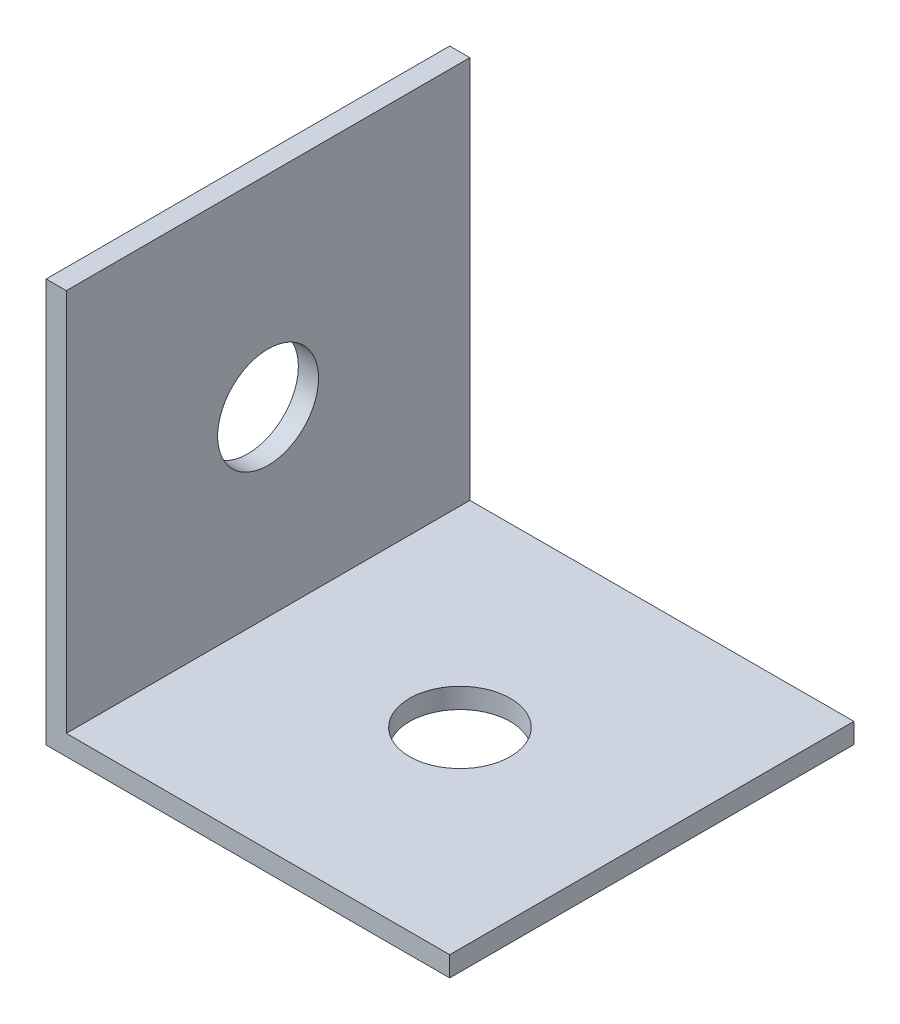
ISO-10303-21;
HEADER;
FILE_DESCRIPTION(('STEP AP214'),'2;1');
FILE_NAME('part.step','',(''),(''),'','','');
FILE_SCHEMA(('AUTOMOTIVE_DESIGN { 1 0 10303 214 1 1 1 1 }'));
ENDSEC;
DATA;
#1=APPLICATION_CONTEXT('core data for automotive mechanical design processes');
#2=APPLICATION_PROTOCOL_DEFINITION('international standard','automotive_design',2000,#1);
#3=PRODUCT_CONTEXT('',#1,'mechanical');
#4=PRODUCT('Part','Part','',(#3));
#5=PRODUCT_RELATED_PRODUCT_CATEGORY('part','',(#4));
#6=PRODUCT_DEFINITION_FORMATION('','',#4);
#7=PRODUCT_DEFINITION_CONTEXT('part definition',#1,'design');
#8=PRODUCT_DEFINITION('design','',#6,#7);
#9=PRODUCT_DEFINITION_SHAPE('','',#8);
#10=(LENGTH_UNIT() NAMED_UNIT(*) SI_UNIT(.MILLI.,.METRE.));
#11=(NAMED_UNIT(*) PLANE_ANGLE_UNIT() SI_UNIT($,.RADIAN.));
#12=(NAMED_UNIT(*) SI_UNIT($,.STERADIAN.) SOLID_ANGLE_UNIT());
#13=UNCERTAINTY_MEASURE_WITH_UNIT(LENGTH_MEASURE(1.E-05),#10,'distance_accuracy_value','');
#14=(GEOMETRIC_REPRESENTATION_CONTEXT(3) GLOBAL_UNCERTAINTY_ASSIGNED_CONTEXT((#13)) GLOBAL_UNIT_ASSIGNED_CONTEXT((#10,
#11,#12)) REPRESENTATION_CONTEXT('',''));
#15=CARTESIAN_POINT('',(0.,0.,0.));
#16=DIRECTION('',(0.,0.,1.));
#17=DIRECTION('',(1.,0.,0.));
#18=AXIS2_PLACEMENT_3D('',#15,#16,#17);
#19=CARTESIAN_POINT('',(1.27,0.,0.));
#20=DIRECTION('',(1.,0.,0.));
#21=DIRECTION('',(0.,0.,-1.));
#22=AXIS2_PLACEMENT_3D('',#19,#20,#21);
#23=PLANE('',#22);
#24=CARTESIAN_POINT('',(1.27,0.,0.));
#25=DIRECTION('',(1.,0.,0.));
#26=DIRECTION('',(0.,0.,-1.));
#27=AXIS2_PLACEMENT_3D('',#24,#25,#26);
#28=CIRCLE('',#27,3.175);
#29=CARTESIAN_POINT('',(1.27,0.,-3.175));
#30=VERTEX_POINT('',#29);
#31=EDGE_CURVE('E161',#30,#30,#28,.T.);
#32=ORIENTED_EDGE('',*,*,#31,.F.);
#33=EDGE_LOOP('',(#32));
#34=FACE_BOUND('',#33,.T.);
#35=DIRECTION('',(0.,-1.,0.));
#36=VECTOR('',#35,1.);
#37=CARTESIAN_POINT('',(1.27,12.7,12.7));
#38=LINE('',#37,#36);
#39=CARTESIAN_POINT('',(1.27,12.7,12.7));
#40=VERTEX_POINT('',#39);
#41=CARTESIAN_POINT('',(1.27,-11.43,12.7));
#42=VERTEX_POINT('',#41);
#43=EDGE_CURVE('E102',#40,#42,#38,.T.);
#44=ORIENTED_EDGE('',*,*,#43,.T.);
#45=DIRECTION('',(0.,0.,-1.));
#46=VECTOR('',#45,1.);
#47=CARTESIAN_POINT('',(1.27,-11.43,12.7));
#48=LINE('',#47,#46);
#49=CARTESIAN_POINT('',(1.27,-11.43,-12.7));
#50=VERTEX_POINT('',#49);
#51=EDGE_CURVE('E126',#42,#50,#48,.T.);
#52=ORIENTED_EDGE('',*,*,#51,.T.);
#53=DIRECTION('',(0.,1.,0.));
#54=VECTOR('',#53,1.);
#55=CARTESIAN_POINT('',(1.27,12.7,-12.7));
#56=LINE('',#55,#54);
#57=CARTESIAN_POINT('',(1.27,12.7,-12.7));
#58=VERTEX_POINT('',#57);
#59=EDGE_CURVE('E93',#50,#58,#56,.T.);
#60=ORIENTED_EDGE('',*,*,#59,.T.);
#61=DIRECTION('',(0.,0.,1.));
#62=VECTOR('',#61,1.);
#63=CARTESIAN_POINT('',(1.27,12.7,12.7));
#64=LINE('',#63,#62);
#65=EDGE_CURVE('E60',#58,#40,#64,.T.);
#66=ORIENTED_EDGE('',*,*,#65,.T.);
#67=EDGE_LOOP('',(#44,#52,#60,#66));
#68=FACE_BOUND('',#67,.T.);
#69=ADVANCED_FACE('F36',(#34,#68),#23,.T.);
#70=CARTESIAN_POINT('',(1.27,12.7,-12.7));
#71=DIRECTION('',(0.,0.,1.));
#72=DIRECTION('',(0.,-1.,0.));
#73=AXIS2_PLACEMENT_3D('',#70,#71,#72);
#74=PLANE('',#73);
#75=DIRECTION('',(0.,1.,0.));
#76=VECTOR('',#75,1.);
#77=CARTESIAN_POINT('',(0.,12.7,-12.7));
#78=LINE('',#77,#76);
#79=CARTESIAN_POINT('',(0.,-12.7,-12.7));
#80=VERTEX_POINT('',#79);
#81=CARTESIAN_POINT('',(0.,12.7,-12.7));
#82=VERTEX_POINT('',#81);
#83=EDGE_CURVE('E99',#80,#82,#78,.T.);
#84=ORIENTED_EDGE('',*,*,#83,.T.);
#85=DIRECTION('',(-1.,0.,0.));
#86=VECTOR('',#85,1.);
#87=CARTESIAN_POINT('',(1.27,12.7,-12.7));
#88=LINE('',#87,#86);
#89=EDGE_CURVE('E11',#58,#82,#88,.T.);
#90=ORIENTED_EDGE('',*,*,#89,.F.);
#91=ORIENTED_EDGE('',*,*,#59,.F.);
#92=CARTESIAN_POINT('',(1.27,-12.7,-12.7));
#93=VERTEX_POINT('',#92);
#94=EDGE_CURVE('E101',#93,#50,#56,.T.);
#95=ORIENTED_EDGE('',*,*,#94,.F.);
#96=DIRECTION('',(-1.,0.,0.));
#97=VECTOR('',#96,1.);
#98=CARTESIAN_POINT('',(1.27,-12.7,-12.7));
#99=LINE('',#98,#97);
#100=EDGE_CURVE('E85',#93,#80,#99,.T.);
#101=ORIENTED_EDGE('',*,*,#100,.T.);
#102=EDGE_LOOP('',(#84,#90,#91,#95,#101));
#103=FACE_BOUND('',#102,.T.);
#104=ADVANCED_FACE('F38',(#103),#74,.F.);
#105=CARTESIAN_POINT('',(1.27,12.7,12.7));
#106=DIRECTION('',(0.,-1.,0.));
#107=DIRECTION('',(0.,0.,-1.));
#108=AXIS2_PLACEMENT_3D('',#105,#106,#107);
#109=PLANE('',#108);
#110=DIRECTION('',(0.,0.,1.));
#111=VECTOR('',#110,1.);
#112=CARTESIAN_POINT('',(0.,12.7,12.7));
#113=LINE('',#112,#111);
#114=CARTESIAN_POINT('',(0.,12.7,12.7));
#115=VERTEX_POINT('',#114);
#116=EDGE_CURVE('E105',#82,#115,#113,.T.);
#117=ORIENTED_EDGE('',*,*,#116,.T.);
#118=DIRECTION('',(-1.,0.,0.));
#119=VECTOR('',#118,1.);
#120=CARTESIAN_POINT('',(1.27,12.7,12.7));
#121=LINE('',#120,#119);
#122=EDGE_CURVE('E44',#40,#115,#121,.T.);
#123=ORIENTED_EDGE('',*,*,#122,.F.);
#124=ORIENTED_EDGE('',*,*,#65,.F.);
#125=ORIENTED_EDGE('',*,*,#89,.T.);
#126=EDGE_LOOP('',(#117,#123,#124,#125));
#127=FACE_BOUND('',#126,.T.);
#128=ADVANCED_FACE('F122',(#127),#109,.F.);
#129=CARTESIAN_POINT('',(1.27,12.7,12.7));
#130=DIRECTION('',(0.,0.,-1.));
#131=DIRECTION('',(0.,1.,0.));
#132=AXIS2_PLACEMENT_3D('',#129,#130,#131);
#133=PLANE('',#132);
#134=DIRECTION('',(0.,-1.,0.));
#135=VECTOR('',#134,1.);
#136=CARTESIAN_POINT('',(0.,12.7,12.7));
#137=LINE('',#136,#135);
#138=CARTESIAN_POINT('',(0.,-12.7,12.7));
#139=VERTEX_POINT('',#138);
#140=EDGE_CURVE('E94',#115,#139,#137,.T.);
#141=ORIENTED_EDGE('',*,*,#140,.T.);
#142=DIRECTION('',(-1.,0.,0.));
#143=VECTOR('',#142,1.);
#144=CARTESIAN_POINT('',(1.27,-12.7,12.7));
#145=LINE('',#144,#143);
#146=CARTESIAN_POINT('',(25.4,-12.7,12.7));
#147=VERTEX_POINT('',#146);
#148=EDGE_CURVE('E89',#147,#139,#145,.T.);
#149=ORIENTED_EDGE('',*,*,#148,.F.);
#150=DIRECTION('',(0.,-1.,0.));
#151=VECTOR('',#150,1.);
#152=CARTESIAN_POINT('',(25.4,-11.43,12.7));
#153=LINE('',#152,#151);
#154=CARTESIAN_POINT('',(25.4,-11.43,12.7));
#155=VERTEX_POINT('',#154);
#156=EDGE_CURVE('E106',#155,#147,#153,.T.);
#157=ORIENTED_EDGE('',*,*,#156,.F.);
#158=DIRECTION('',(-1.,0.,0.));
#159=VECTOR('',#158,1.);
#160=CARTESIAN_POINT('',(1.27,-11.43,12.7));
#161=LINE('',#160,#159);
#162=EDGE_CURVE('E148',#155,#42,#161,.T.);
#163=ORIENTED_EDGE('',*,*,#162,.T.);
#164=ORIENTED_EDGE('',*,*,#43,.F.);
#165=ORIENTED_EDGE('',*,*,#122,.T.);
#166=EDGE_LOOP('',(#141,#149,#157,#163,#164,#165));
#167=FACE_BOUND('',#166,.T.);
#168=ADVANCED_FACE('F119',(#167),#133,.F.);
#169=CARTESIAN_POINT('',(1.27,-12.7,12.7));
#170=DIRECTION('',(0.,1.,0.));
#171=DIRECTION('',(0.,0.,1.));
#172=AXIS2_PLACEMENT_3D('',#169,#170,#171);
#173=PLANE('',#172);
#174=CARTESIAN_POINT('',(13.335,-12.7,-0.00966250279427205));
#175=DIRECTION('',(0.,1.,0.));
#176=DIRECTION('',(0.,0.,1.));
#177=AXIS2_PLACEMENT_3D('',#174,#175,#176);
#178=CIRCLE('',#177,3.175);
#179=CARTESIAN_POINT('',(13.335,-12.7,3.16533749720573));
#180=VERTEX_POINT('',#179);
#181=EDGE_CURVE('E166',#180,#180,#178,.T.);
#182=ORIENTED_EDGE('',*,*,#181,.T.);
#183=EDGE_LOOP('',(#182));
#184=FACE_BOUND('',#183,.T.);
#185=DIRECTION('',(0.,0.,-1.));
#186=VECTOR('',#185,1.);
#187=CARTESIAN_POINT('',(0.,-12.7,12.7));
#188=LINE('',#187,#186);
#189=EDGE_CURVE('E80',#139,#80,#188,.T.);
#190=ORIENTED_EDGE('',*,*,#189,.T.);
#191=ORIENTED_EDGE('',*,*,#100,.F.);
#192=DIRECTION('',(0.999998717215297,0.,-0.00160173898041636));
#193=VECTOR('',#192,1.);
#194=CARTESIAN_POINT('',(25.4,-12.7,-12.7386500111771));
#195=LINE('',#194,#193);
#196=CARTESIAN_POINT('',(25.4,-12.7,-12.7386500111771));
#197=VERTEX_POINT('',#196);
#198=EDGE_CURVE('E157',#93,#197,#195,.T.);
#199=ORIENTED_EDGE('',*,*,#198,.T.);
#200=DIRECTION('',(0.,0.,1.));
#201=VECTOR('',#200,1.);
#202=CARTESIAN_POINT('',(25.4,-12.7,12.7));
#203=LINE('',#202,#201);
#204=EDGE_CURVE('E146',#197,#147,#203,.T.);
#205=ORIENTED_EDGE('',*,*,#204,.T.);
#206=ORIENTED_EDGE('',*,*,#148,.T.);
#207=EDGE_LOOP('',(#190,#191,#199,#205,#206));
#208=FACE_BOUND('',#207,.T.);
#209=ADVANCED_FACE('F82',(#184,#208),#173,.F.);
#210=CARTESIAN_POINT('',(0.,0.,0.));
#211=DIRECTION('',(1.,0.,0.));
#212=DIRECTION('',(0.,0.,-1.));
#213=AXIS2_PLACEMENT_3D('',#210,#211,#212);
#214=PLANE('',#213);
#215=CARTESIAN_POINT('',(0.,0.,0.));
#216=DIRECTION('',(1.,0.,0.));
#217=DIRECTION('',(0.,0.,-1.));
#218=AXIS2_PLACEMENT_3D('',#215,#216,#217);
#219=CIRCLE('',#218,3.175);
#220=CARTESIAN_POINT('',(0.,0.,-3.175));
#221=VERTEX_POINT('',#220);
#222=EDGE_CURVE('E159',#221,#221,#219,.T.);
#223=ORIENTED_EDGE('',*,*,#222,.T.);
#224=EDGE_LOOP('',(#223));
#225=FACE_BOUND('',#224,.T.);
#226=ORIENTED_EDGE('',*,*,#83,.F.);
#227=ORIENTED_EDGE('',*,*,#189,.F.);
#228=ORIENTED_EDGE('',*,*,#140,.F.);
#229=ORIENTED_EDGE('',*,*,#116,.F.);
#230=EDGE_LOOP('',(#226,#227,#228,#229));
#231=FACE_BOUND('',#230,.T.);
#232=ADVANCED_FACE('F104',(#225,#231),#214,.F.);
#233=CARTESIAN_POINT('',(25.4,-11.43,12.7));
#234=DIRECTION('',(1.,0.,0.));
#235=DIRECTION('',(0.,0.,-1.));
#236=AXIS2_PLACEMENT_3D('',#233,#234,#235);
#237=PLANE('',#236);
#238=ORIENTED_EDGE('',*,*,#204,.F.);
#239=DIRECTION('',(0.,-1.,0.));
#240=VECTOR('',#239,1.);
#241=CARTESIAN_POINT('',(25.4,-11.43,-12.7386500111771));
#242=LINE('',#241,#240);
#243=CARTESIAN_POINT('',(25.4,-11.43,-12.7386500111771));
#244=VERTEX_POINT('',#243);
#245=EDGE_CURVE('E110',#244,#197,#242,.T.);
#246=ORIENTED_EDGE('',*,*,#245,.F.);
#247=DIRECTION('',(0.,0.,1.));
#248=VECTOR('',#247,1.);
#249=CARTESIAN_POINT('',(25.4,-11.43,12.7));
#250=LINE('',#249,#248);
#251=EDGE_CURVE('E145',#244,#155,#250,.T.);
#252=ORIENTED_EDGE('',*,*,#251,.T.);
#253=ORIENTED_EDGE('',*,*,#156,.T.);
#254=EDGE_LOOP('',(#238,#246,#252,#253));
#255=FACE_BOUND('',#254,.T.);
#256=ADVANCED_FACE('F144',(#255),#237,.T.);
#257=CARTESIAN_POINT('',(25.4,-11.43,-12.7386500111771));
#258=DIRECTION('',(-0.00160173898041636,0.,-0.999998717215296));
#259=DIRECTION('',(-0.999998717215297,0.,0.00160173898041636));
#260=AXIS2_PLACEMENT_3D('',#257,#258,#259);
#261=PLANE('',#260);
#262=ORIENTED_EDGE('',*,*,#198,.F.);
#263=ORIENTED_EDGE('',*,*,#94,.T.);
#264=DIRECTION('',(0.999998717215297,0.,-0.00160173898041636));
#265=VECTOR('',#264,1.);
#266=CARTESIAN_POINT('',(25.4,-11.43,-12.7386500111771));
#267=LINE('',#266,#265);
#268=EDGE_CURVE('E51',#50,#244,#267,.T.);
#269=ORIENTED_EDGE('',*,*,#268,.T.);
#270=ORIENTED_EDGE('',*,*,#245,.T.);
#271=EDGE_LOOP('',(#262,#263,#269,#270));
#272=FACE_BOUND('',#271,.T.);
#273=ADVANCED_FACE('F151',(#272),#261,.T.);
#274=CARTESIAN_POINT('',(0.,-11.43,0.));
#275=DIRECTION('',(0.,-1.,0.));
#276=DIRECTION('',(0.,0.,-1.));
#277=AXIS2_PLACEMENT_3D('',#274,#275,#276);
#278=PLANE('',#277);
#279=CARTESIAN_POINT('',(13.335,-11.43,-0.00966250279427205));
#280=DIRECTION('',(0.,1.,0.));
#281=DIRECTION('',(0.,0.,1.));
#282=AXIS2_PLACEMENT_3D('',#279,#280,#281);
#283=CIRCLE('',#282,3.175);
#284=CARTESIAN_POINT('',(13.335,-11.43,3.16533749720573));
#285=VERTEX_POINT('',#284);
#286=EDGE_CURVE('E168',#285,#285,#283,.T.);
#287=ORIENTED_EDGE('',*,*,#286,.F.);
#288=EDGE_LOOP('',(#287));
#289=FACE_BOUND('',#288,.T.);
#290=ORIENTED_EDGE('',*,*,#51,.F.);
#291=ORIENTED_EDGE('',*,*,#162,.F.);
#292=ORIENTED_EDGE('',*,*,#251,.F.);
#293=ORIENTED_EDGE('',*,*,#268,.F.);
#294=EDGE_LOOP('',(#290,#291,#292,#293));
#295=FACE_BOUND('',#294,.T.);
#296=ADVANCED_FACE('F149',(#289,#295),#278,.F.);
#297=CARTESIAN_POINT('',(0.,0.,0.));
#298=DIRECTION('',(1.,0.,0.));
#299=DIRECTION('',(0.,0.,-1.));
#300=AXIS2_PLACEMENT_3D('',#297,#298,#299);
#301=CYLINDRICAL_SURFACE('',#300,3.175);
#302=ORIENTED_EDGE('',*,*,#222,.F.);
#303=EDGE_LOOP('',(#302));
#304=FACE_BOUND('',#303,.T.);
#305=ORIENTED_EDGE('',*,*,#31,.T.);
#306=EDGE_LOOP('',(#305));
#307=FACE_BOUND('',#306,.T.);
#308=ADVANCED_FACE('F178',(#304,#307),#301,.F.);
#309=CARTESIAN_POINT('',(13.335,-12.7,-0.00966250279427205));
#310=DIRECTION('',(0.,1.,0.));
#311=DIRECTION('',(0.,0.,1.));
#312=AXIS2_PLACEMENT_3D('',#309,#310,#311);
#313=CYLINDRICAL_SURFACE('',#312,3.175);
#314=ORIENTED_EDGE('',*,*,#181,.F.);
#315=EDGE_LOOP('',(#314));
#316=FACE_BOUND('',#315,.T.);
#317=ORIENTED_EDGE('',*,*,#286,.T.);
#318=EDGE_LOOP('',(#317));
#319=FACE_BOUND('',#318,.T.);
#320=ADVANCED_FACE('F175',(#316,#319),#313,.F.);
#321=CLOSED_SHELL('',(#69,#104,#128,#168,#209,#232,#256,#273,#296,#308,#320));
#322=MANIFOLD_SOLID_BREP('B2',#321);
#323=ADVANCED_BREP_SHAPE_REPRESENTATION('',(#18,#322),#14);
#324=SHAPE_DEFINITION_REPRESENTATION(#9,#323);
ENDSEC;
END-ISO-10303-21;
